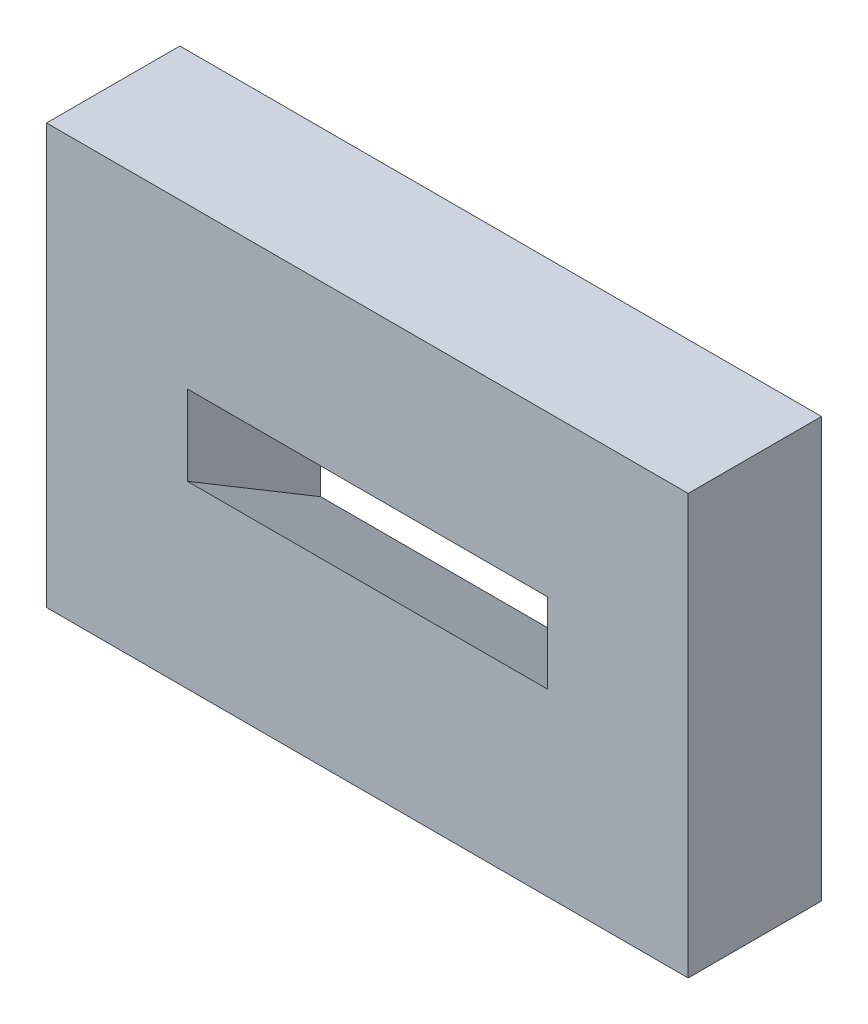
ISO-10303-21;
HEADER;
FILE_DESCRIPTION(('STEP AP214'),'2;1');
FILE_NAME('part.step','',(''),(''),'','','');
FILE_SCHEMA(('AUTOMOTIVE_DESIGN { 1 0 10303 214 1 1 1 1 }'));
ENDSEC;
DATA;
#1=APPLICATION_CONTEXT('core data for automotive mechanical design processes');
#2=APPLICATION_PROTOCOL_DEFINITION('international standard','automotive_design',2000,#1);
#3=PRODUCT_CONTEXT('',#1,'mechanical');
#4=PRODUCT('Part','Part','',(#3));
#5=PRODUCT_RELATED_PRODUCT_CATEGORY('part','',(#4));
#6=PRODUCT_DEFINITION_FORMATION('','',#4);
#7=PRODUCT_DEFINITION_CONTEXT('part definition',#1,'design');
#8=PRODUCT_DEFINITION('design','',#6,#7);
#9=PRODUCT_DEFINITION_SHAPE('','',#8);
#10=(LENGTH_UNIT() NAMED_UNIT(*) SI_UNIT(.MILLI.,.METRE.));
#11=(NAMED_UNIT(*) PLANE_ANGLE_UNIT() SI_UNIT($,.RADIAN.));
#12=(NAMED_UNIT(*) SI_UNIT($,.STERADIAN.) SOLID_ANGLE_UNIT());
#13=UNCERTAINTY_MEASURE_WITH_UNIT(LENGTH_MEASURE(1.E-05),#10,'distance_accuracy_value','');
#14=(GEOMETRIC_REPRESENTATION_CONTEXT(3) GLOBAL_UNCERTAINTY_ASSIGNED_CONTEXT((#13)) GLOBAL_UNIT_ASSIGNED_CONTEXT((#10,
#11,#12)) REPRESENTATION_CONTEXT('',''));
#15=CARTESIAN_POINT('',(0.,0.,0.));
#16=DIRECTION('',(0.,0.,1.));
#17=DIRECTION('',(1.,0.,0.));
#18=AXIS2_PLACEMENT_3D('',#15,#16,#17);
#19=CARTESIAN_POINT('',(-55.,85.,5.));
#20=DIRECTION('',(0.,-1.,0.));
#21=DIRECTION('',(0.,0.,-1.));
#22=AXIS2_PLACEMENT_3D('',#19,#20,#21);
#23=PLANE('',#22);
#24=DIRECTION('',(-1.,0.,0.));
#25=VECTOR('',#24,1.);
#26=CARTESIAN_POINT('',(-55.,85.,0.));
#27=LINE('',#26,#25);
#28=CARTESIAN_POINT('',(12.0365305164874,85.,0.));
#29=VERTEX_POINT('',#28);
#30=CARTESIAN_POINT('',(-12.0365305164875,85.,0.));
#31=VERTEX_POINT('',#30);
#32=EDGE_CURVE('E156',#29,#31,#27,.T.);
#33=ORIENTED_EDGE('',*,*,#32,.T.);
#34=DIRECTION('',(0.,0.,1.));
#35=VECTOR('',#34,1.);
#36=CARTESIAN_POINT('',(-12.0365305164875,85.,5.));
#37=LINE('',#36,#35);
#38=CARTESIAN_POINT('',(-12.0365305164875,85.,5.));
#39=VERTEX_POINT('',#38);
#40=EDGE_CURVE('E120',#31,#39,#37,.T.);
#41=ORIENTED_EDGE('',*,*,#40,.T.);
#42=DIRECTION('',(-1.,0.,0.));
#43=VECTOR('',#42,1.);
#44=CARTESIAN_POINT('',(-55.,85.,5.));
#45=LINE('',#44,#43);
#46=CARTESIAN_POINT('',(12.0365305164874,85.,5.));
#47=VERTEX_POINT('',#46);
#48=EDGE_CURVE('E159',#47,#39,#45,.T.);
#49=ORIENTED_EDGE('',*,*,#48,.F.);
#50=DIRECTION('',(0.,0.,-1.));
#51=VECTOR('',#50,1.);
#52=CARTESIAN_POINT('',(12.0365305164874,85.,5.));
#53=LINE('',#52,#51);
#54=EDGE_CURVE('E139',#47,#29,#53,.T.);
#55=ORIENTED_EDGE('',*,*,#54,.T.);
#56=EDGE_LOOP('',(#33,#41,#49,#55));
#57=FACE_BOUND('',#56,.T.);
#58=ADVANCED_FACE('F37',(#57),#23,.F.);
#59=CARTESIAN_POINT('',(0.,0.,5.));
#60=DIRECTION('',(0.,0.,-1.));
#61=DIRECTION('',(-1.,0.,0.));
#62=AXIS2_PLACEMENT_3D('',#59,#60,#61);
#63=PLANE('',#62);
#64=DIRECTION('',(-1.,0.,0.));
#65=VECTOR('',#64,1.);
#66=CARTESIAN_POINT('',(-6.74999999999998,79.,5.));
#67=LINE('',#66,#65);
#68=CARTESIAN_POINT('',(6.75000000000002,79.,5.));
#69=VERTEX_POINT('',#68);
#70=CARTESIAN_POINT('',(-6.74999999999998,79.,5.));
#71=VERTEX_POINT('',#70);
#72=EDGE_CURVE('E144',#69,#71,#67,.T.);
#73=ORIENTED_EDGE('',*,*,#72,.F.);
#74=DIRECTION('',(0.,1.,0.));
#75=VECTOR('',#74,1.);
#76=CARTESIAN_POINT('',(6.75000000000002,76.,5.));
#77=LINE('',#76,#75);
#78=CARTESIAN_POINT('',(6.75000000000002,76.,5.));
#79=VERTEX_POINT('',#78);
#80=EDGE_CURVE('E142',#79,#69,#77,.T.);
#81=ORIENTED_EDGE('',*,*,#80,.F.);
#82=DIRECTION('',(1.,0.,0.));
#83=VECTOR('',#82,1.);
#84=CARTESIAN_POINT('',(-6.74999999999998,76.,5.));
#85=LINE('',#84,#83);
#86=CARTESIAN_POINT('',(-6.74999999999998,76.,5.));
#87=VERTEX_POINT('',#86);
#88=EDGE_CURVE('E150',#87,#79,#85,.T.);
#89=ORIENTED_EDGE('',*,*,#88,.F.);
#90=DIRECTION('',(0.,-1.,0.));
#91=VECTOR('',#90,1.);
#92=CARTESIAN_POINT('',(-6.74999999999998,76.,5.));
#93=LINE('',#92,#91);
#94=EDGE_CURVE('E147',#71,#87,#93,.T.);
#95=ORIENTED_EDGE('',*,*,#94,.F.);
#96=EDGE_LOOP('',(#73,#81,#89,#95));
#97=FACE_BOUND('',#96,.T.);
#98=ORIENTED_EDGE('',*,*,#48,.T.);
#99=DIRECTION('',(0.,-1.,0.));
#100=VECTOR('',#99,1.);
#101=CARTESIAN_POINT('',(-12.0365305164875,0.,5.));
#102=LINE('',#101,#100);
#103=CARTESIAN_POINT('',(-12.0365305164875,69.2556614593045,5.));
#104=VERTEX_POINT('',#103);
#105=EDGE_CURVE('E133',#39,#104,#102,.T.);
#106=ORIENTED_EDGE('',*,*,#105,.T.);
#107=DIRECTION('',(1.,0.,0.));
#108=VECTOR('',#107,1.);
#109=CARTESIAN_POINT('',(0.,69.2556614593045,5.));
#110=LINE('',#109,#108);
#111=CARTESIAN_POINT('',(12.0365305164874,69.2556614593045,5.));
#112=VERTEX_POINT('',#111);
#113=EDGE_CURVE('E111',#104,#112,#110,.T.);
#114=ORIENTED_EDGE('',*,*,#113,.T.);
#115=DIRECTION('',(0.,1.,0.));
#116=VECTOR('',#115,1.);
#117=CARTESIAN_POINT('',(12.0365305164874,0.,5.));
#118=LINE('',#117,#116);
#119=EDGE_CURVE('E136',#112,#47,#118,.T.);
#120=ORIENTED_EDGE('',*,*,#119,.T.);
#121=EDGE_LOOP('',(#98,#106,#114,#120));
#122=FACE_BOUND('',#121,.T.);
#123=ADVANCED_FACE('F181',(#97,#122),#63,.F.);
#124=CARTESIAN_POINT('',(0.,0.,0.));
#125=DIRECTION('',(0.,0.,-1.));
#126=DIRECTION('',(-1.,0.,0.));
#127=AXIS2_PLACEMENT_3D('',#124,#125,#126);
#128=PLANE('',#127);
#129=DIRECTION('',(0.,1.,0.));
#130=VECTOR('',#129,1.);
#131=CARTESIAN_POINT('',(-12.0365305164875,88.6749685352118,0.));
#132=LINE('',#131,#130);
#133=CARTESIAN_POINT('',(-12.0365305164875,69.2556614593045,0.));
#134=VERTEX_POINT('',#133);
#135=EDGE_CURVE('E117',#134,#31,#132,.T.);
#136=ORIENTED_EDGE('',*,*,#135,.T.);
#137=ORIENTED_EDGE('',*,*,#32,.F.);
#138=DIRECTION('',(0.,-1.,0.));
#139=VECTOR('',#138,1.);
#140=CARTESIAN_POINT('',(12.0365305164874,69.2556614593045,0.));
#141=LINE('',#140,#139);
#142=CARTESIAN_POINT('',(12.0365305164875,69.2556614593045,0.));
#143=VERTEX_POINT('',#142);
#144=EDGE_CURVE('E127',#29,#143,#141,.T.);
#145=ORIENTED_EDGE('',*,*,#144,.T.);
#146=DIRECTION('',(-1.,0.,0.));
#147=VECTOR('',#146,1.);
#148=CARTESIAN_POINT('',(-12.0365305164875,69.2556614593045,0.));
#149=LINE('',#148,#147);
#150=EDGE_CURVE('E108',#143,#134,#149,.T.);
#151=ORIENTED_EDGE('',*,*,#150,.T.);
#152=EDGE_LOOP('',(#136,#137,#145,#151));
#153=FACE_BOUND('',#152,.T.);
#154=DIRECTION('',(0.,1.,0.));
#155=VECTOR('',#154,1.);
#156=CARTESIAN_POINT('',(-6.74999999999998,0.,0.));
#157=LINE('',#156,#155);
#158=CARTESIAN_POINT('',(-6.74999999999998,73.,0.));
#159=VERTEX_POINT('',#158);
#160=CARTESIAN_POINT('',(-6.74999999999998,79.,0.));
#161=VERTEX_POINT('',#160);
#162=EDGE_CURVE('E53',#159,#161,#157,.T.);
#163=ORIENTED_EDGE('',*,*,#162,.F.);
#164=DIRECTION('',(1.,0.,0.));
#165=VECTOR('',#164,1.);
#166=CARTESIAN_POINT('',(6.75000000000002,73.,0.));
#167=LINE('',#166,#165);
#168=CARTESIAN_POINT('',(6.75000000000002,73.,0.));
#169=VERTEX_POINT('',#168);
#170=EDGE_CURVE('E167',#159,#169,#167,.T.);
#171=ORIENTED_EDGE('',*,*,#170,.T.);
#172=DIRECTION('',(0.,-1.,0.));
#173=VECTOR('',#172,1.);
#174=CARTESIAN_POINT('',(6.75000000000004,0.,0.));
#175=LINE('',#174,#173);
#176=CARTESIAN_POINT('',(6.75000000000002,79.,0.));
#177=VERTEX_POINT('',#176);
#178=EDGE_CURVE('E60',#177,#169,#175,.T.);
#179=ORIENTED_EDGE('',*,*,#178,.F.);
#180=DIRECTION('',(1.,0.,0.));
#181=VECTOR('',#180,1.);
#182=CARTESIAN_POINT('',(0.,79.,0.));
#183=LINE('',#182,#181);
#184=EDGE_CURVE('E162',#161,#177,#183,.T.);
#185=ORIENTED_EDGE('',*,*,#184,.F.);
#186=EDGE_LOOP('',(#163,#171,#179,#185));
#187=FACE_BOUND('',#186,.T.);
#188=ADVANCED_FACE('F126',(#153,#187),#128,.T.);
#189=CARTESIAN_POINT('',(6.75000000000002,76.,-67.377858586164));
#190=DIRECTION('',(1.,0.,0.));
#191=DIRECTION('',(0.,1.,0.));
#192=AXIS2_PLACEMENT_3D('',#189,#190,#191);
#193=PLANE('',#192);
#194=ORIENTED_EDGE('',*,*,#178,.T.);
#195=DIRECTION('',(0.,0.514495755427526,0.857492925712544));
#196=VECTOR('',#195,1.);
#197=CARTESIAN_POINT('',(6.75000000000003,44.0685918002218,-48.2190136662971));
#198=LINE('',#197,#196);
#199=EDGE_CURVE('E11',#169,#79,#198,.T.);
#200=ORIENTED_EDGE('',*,*,#199,.T.);
#201=ORIENTED_EDGE('',*,*,#80,.T.);
#202=DIRECTION('',(0.,0.,1.));
#203=VECTOR('',#202,1.);
#204=CARTESIAN_POINT('',(6.75000000000002,79.,-67.377858586164));
#205=LINE('',#204,#203);
#206=EDGE_CURVE('E153',#177,#69,#205,.T.);
#207=ORIENTED_EDGE('',*,*,#206,.F.);
#208=EDGE_LOOP('',(#194,#200,#201,#207));
#209=FACE_BOUND('',#208,.T.);
#210=ADVANCED_FACE('F178',(#209),#193,.F.);
#211=CARTESIAN_POINT('',(-6.74999999999998,76.,-67.377858586164));
#212=DIRECTION('',(-1.,0.,0.));
#213=DIRECTION('',(0.,0.,1.));
#214=AXIS2_PLACEMENT_3D('',#211,#212,#213);
#215=PLANE('',#214);
#216=ORIENTED_EDGE('',*,*,#162,.T.);
#217=DIRECTION('',(0.,0.,1.));
#218=VECTOR('',#217,1.);
#219=CARTESIAN_POINT('',(-6.74999999999998,79.,-67.377858586164));
#220=LINE('',#219,#218);
#221=EDGE_CURVE('E154',#161,#71,#220,.T.);
#222=ORIENTED_EDGE('',*,*,#221,.T.);
#223=ORIENTED_EDGE('',*,*,#94,.T.);
#224=DIRECTION('',(0.,-0.514495755427526,-0.857492925712544));
#225=VECTOR('',#224,1.);
#226=CARTESIAN_POINT('',(-6.74999999999998,44.0685918002218,-48.2190136662971));
#227=LINE('',#226,#225);
#228=EDGE_CURVE('E46',#87,#159,#227,.T.);
#229=ORIENTED_EDGE('',*,*,#228,.T.);
#230=EDGE_LOOP('',(#216,#222,#223,#229));
#231=FACE_BOUND('',#230,.T.);
#232=ADVANCED_FACE('F170',(#231),#215,.F.);
#233=CARTESIAN_POINT('',(-6.74999999999998,79.,-67.377858586164));
#234=DIRECTION('',(0.,1.,0.));
#235=DIRECTION('',(0.,0.,1.));
#236=AXIS2_PLACEMENT_3D('',#233,#234,#235);
#237=PLANE('',#236);
#238=ORIENTED_EDGE('',*,*,#184,.T.);
#239=ORIENTED_EDGE('',*,*,#206,.T.);
#240=ORIENTED_EDGE('',*,*,#72,.T.);
#241=ORIENTED_EDGE('',*,*,#221,.F.);
#242=EDGE_LOOP('',(#238,#239,#240,#241));
#243=FACE_BOUND('',#242,.T.);
#244=ADVANCED_FACE('F176',(#243),#237,.F.);
#245=CARTESIAN_POINT('',(12.0365305164874,69.2556614593045,0.));
#246=DIRECTION('',(-1.,0.,0.));
#247=DIRECTION('',(0.,0.,1.));
#248=AXIS2_PLACEMENT_3D('',#245,#246,#247);
#249=PLANE('',#248);
#250=ORIENTED_EDGE('',*,*,#119,.F.);
#251=DIRECTION('',(0.,0.,1.));
#252=VECTOR('',#251,1.);
#253=CARTESIAN_POINT('',(12.0365305164874,69.2556614593045,0.));
#254=LINE('',#253,#252);
#255=EDGE_CURVE('E114',#143,#112,#254,.T.);
#256=ORIENTED_EDGE('',*,*,#255,.F.);
#257=ORIENTED_EDGE('',*,*,#144,.F.);
#258=ORIENTED_EDGE('',*,*,#54,.F.);
#259=EDGE_LOOP('',(#250,#256,#257,#258));
#260=FACE_BOUND('',#259,.T.);
#261=ADVANCED_FACE('F188',(#260),#249,.F.);
#262=CARTESIAN_POINT('',(-12.0365305164875,88.6749685352118,0.));
#263=DIRECTION('',(1.,0.,0.));
#264=DIRECTION('',(0.,0.,-1.));
#265=AXIS2_PLACEMENT_3D('',#262,#263,#264);
#266=PLANE('',#265);
#267=ORIENTED_EDGE('',*,*,#135,.F.);
#268=DIRECTION('',(0.,0.,1.));
#269=VECTOR('',#268,1.);
#270=CARTESIAN_POINT('',(-12.0365305164875,69.2556614593045,0.));
#271=LINE('',#270,#269);
#272=EDGE_CURVE('E103',#134,#104,#271,.T.);
#273=ORIENTED_EDGE('',*,*,#272,.T.);
#274=ORIENTED_EDGE('',*,*,#105,.F.);
#275=ORIENTED_EDGE('',*,*,#40,.F.);
#276=EDGE_LOOP('',(#267,#273,#274,#275));
#277=FACE_BOUND('',#276,.T.);
#278=ADVANCED_FACE('F118',(#277),#266,.F.);
#279=CARTESIAN_POINT('',(-12.0365305164875,69.2556614593045,0.));
#280=DIRECTION('',(0.,1.,0.));
#281=DIRECTION('',(0.,0.,1.));
#282=AXIS2_PLACEMENT_3D('',#279,#280,#281);
#283=PLANE('',#282);
#284=ORIENTED_EDGE('',*,*,#272,.F.);
#285=ORIENTED_EDGE('',*,*,#150,.F.);
#286=ORIENTED_EDGE('',*,*,#255,.T.);
#287=ORIENTED_EDGE('',*,*,#113,.F.);
#288=EDGE_LOOP('',(#284,#285,#286,#287));
#289=FACE_BOUND('',#288,.T.);
#290=ADVANCED_FACE('F105',(#289),#283,.F.);
#291=CARTESIAN_POINT('',(-6.74999999999998,76.,5.00000000000003));
#292=DIRECTION('',(0.,0.857492925712544,-0.514495755427526));
#293=DIRECTION('',(1.,0.,0.));
#294=AXIS2_PLACEMENT_3D('',#291,#292,#293);
#295=PLANE('',#294);
#296=ORIENTED_EDGE('',*,*,#199,.F.);
#297=ORIENTED_EDGE('',*,*,#170,.F.);
#298=ORIENTED_EDGE('',*,*,#228,.F.);
#299=ORIENTED_EDGE('',*,*,#88,.T.);
#300=EDGE_LOOP('',(#296,#297,#298,#299));
#301=FACE_BOUND('',#300,.T.);
#302=ADVANCED_FACE('F40',(#301),#295,.T.);
#303=CLOSED_SHELL('',(#58,#123,#188,#210,#232,#244,#261,#278,#290,#302));
#304=MANIFOLD_SOLID_BREP('B2',#303);
#305=ADVANCED_BREP_SHAPE_REPRESENTATION('',(#18,#304),#14);
#306=SHAPE_DEFINITION_REPRESENTATION(#9,#305);
ENDSEC;
END-ISO-10303-21;
